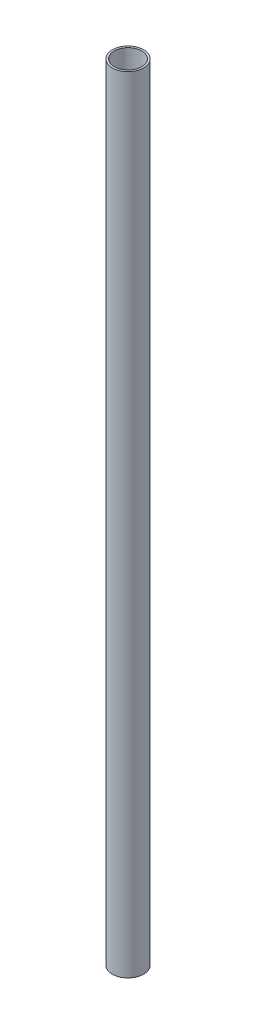
ISO-10303-21;
HEADER;
FILE_DESCRIPTION(('STEP AP214'),'2;1');
FILE_NAME('part.step','',(''),(''),'','','');
FILE_SCHEMA(('AUTOMOTIVE_DESIGN { 1 0 10303 214 1 1 1 1 }'));
ENDSEC;
DATA;
#1=APPLICATION_CONTEXT('core data for automotive mechanical design processes');
#2=APPLICATION_PROTOCOL_DEFINITION('international standard','automotive_design',2000,#1);
#3=PRODUCT_CONTEXT('',#1,'mechanical');
#4=PRODUCT('Part','Part','',(#3));
#5=PRODUCT_RELATED_PRODUCT_CATEGORY('part','',(#4));
#6=PRODUCT_DEFINITION_FORMATION('','',#4);
#7=PRODUCT_DEFINITION_CONTEXT('part definition',#1,'design');
#8=PRODUCT_DEFINITION('design','',#6,#7);
#9=PRODUCT_DEFINITION_SHAPE('','',#8);
#10=(LENGTH_UNIT() NAMED_UNIT(*) SI_UNIT(.MILLI.,.METRE.));
#11=(NAMED_UNIT(*) PLANE_ANGLE_UNIT() SI_UNIT($,.RADIAN.));
#12=(NAMED_UNIT(*) SI_UNIT($,.STERADIAN.) SOLID_ANGLE_UNIT());
#13=UNCERTAINTY_MEASURE_WITH_UNIT(LENGTH_MEASURE(1.E-05),#10,'distance_accuracy_value','');
#14=(GEOMETRIC_REPRESENTATION_CONTEXT(3) GLOBAL_UNCERTAINTY_ASSIGNED_CONTEXT((#13)) GLOBAL_UNIT_ASSIGNED_CONTEXT((#10,
#11,#12)) REPRESENTATION_CONTEXT('',''));
#15=CARTESIAN_POINT('',(0.,0.,0.));
#16=DIRECTION('',(0.,0.,1.));
#17=DIRECTION('',(1.,0.,0.));
#18=AXIS2_PLACEMENT_3D('',#15,#16,#17);
#19=CARTESIAN_POINT('',(0.,5.,0.));
#20=DIRECTION('',(0.,1.,0.));
#21=DIRECTION('',(0.,0.,1.));
#22=AXIS2_PLACEMENT_3D('',#19,#20,#21);
#23=PLANE('',#22);
#24=CARTESIAN_POINT('',(0.,5.,0.));
#25=DIRECTION('',(0.,1.,0.));
#26=DIRECTION('',(0.,0.,1.));
#27=AXIS2_PLACEMENT_3D('',#24,#25,#26);
#28=CIRCLE('',#27,3.5);
#29=CARTESIAN_POINT('',(0.,5.,3.5));
#30=VERTEX_POINT('',#29);
#31=EDGE_CURVE('E48',#30,#30,#28,.T.);
#32=ORIENTED_EDGE('',*,*,#31,.T.);
#33=EDGE_LOOP('',(#32));
#34=FACE_BOUND('',#33,.T.);
#35=CARTESIAN_POINT('',(0.,5.,0.));
#36=DIRECTION('',(0.,-1.,0.));
#37=DIRECTION('',(0.,0.,-1.));
#38=AXIS2_PLACEMENT_3D('',#35,#36,#37);
#39=CIRCLE('',#38,4.);
#40=CARTESIAN_POINT('',(0.,5.,-4.));
#41=VERTEX_POINT('',#40);
#42=EDGE_CURVE('E44',#41,#41,#39,.T.);
#43=ORIENTED_EDGE('',*,*,#42,.T.);
#44=EDGE_LOOP('',(#43));
#45=FACE_BOUND('',#44,.T.);
#46=ADVANCED_FACE('F33',(#34,#45),#23,.F.);
#47=CARTESIAN_POINT('',(0.,205.,0.));
#48=DIRECTION('',(0.,1.,0.));
#49=DIRECTION('',(0.,0.,1.));
#50=AXIS2_PLACEMENT_3D('',#47,#48,#49);
#51=PLANE('',#50);
#52=CARTESIAN_POINT('',(0.,205.,0.));
#53=DIRECTION('',(0.,1.,0.));
#54=DIRECTION('',(0.,0.,1.));
#55=AXIS2_PLACEMENT_3D('',#52,#53,#54);
#56=CIRCLE('',#55,3.5);
#57=CARTESIAN_POINT('',(0.,205.,3.5));
#58=VERTEX_POINT('',#57);
#59=EDGE_CURVE('E53',#58,#58,#56,.T.);
#60=ORIENTED_EDGE('',*,*,#59,.F.);
#61=EDGE_LOOP('',(#60));
#62=FACE_BOUND('',#61,.T.);
#63=CARTESIAN_POINT('',(0.,205.,0.));
#64=DIRECTION('',(0.,-1.,0.));
#65=DIRECTION('',(0.,0.,-1.));
#66=AXIS2_PLACEMENT_3D('',#63,#64,#65);
#67=CIRCLE('',#66,4.);
#68=CARTESIAN_POINT('',(0.,205.,-4.));
#69=VERTEX_POINT('',#68);
#70=EDGE_CURVE('E10',#69,#69,#67,.T.);
#71=ORIENTED_EDGE('',*,*,#70,.F.);
#72=EDGE_LOOP('',(#71));
#73=FACE_BOUND('',#72,.T.);
#74=ADVANCED_FACE('F75',(#62,#73),#51,.T.);
#75=CARTESIAN_POINT('',(0.,5.,0.));
#76=DIRECTION('',(0.,-1.,0.));
#77=DIRECTION('',(0.,0.,-1.));
#78=AXIS2_PLACEMENT_3D('',#75,#76,#77);
#79=CYLINDRICAL_SURFACE('',#78,4.);
#80=CARTESIAN_POINT('',(-3.70809924354783,27.7,-1.5));
#81=CARTESIAN_POINT('',(-3.70809640633806,27.6189925162792,-1.50000304106109));
#82=CARTESIAN_POINT('',(-3.71078260240986,27.5380050774964,-1.49341597549487));
#83=CARTESIAN_POINT('',(-3.72116159304967,27.3784719170868,-1.46736187895468));
#84=CARTESIAN_POINT('',(-3.72885423767112,27.299926122405,-1.44789523373263));
#85=CARTESIAN_POINT('',(-3.748254802809,27.1476246283865,-1.39689657610574));
#86=CARTESIAN_POINT('',(-3.7599530956926,27.0738579433489,-1.36539347266348));
#87=CARTESIAN_POINT('',(-3.78603134206598,26.9326281031812,-1.29131856742698));
#88=CARTESIAN_POINT('',(-3.80041210067323,26.8651668497175,-1.24874344095039));
#89=CARTESIAN_POINT('',(-3.83103574665713,26.7351096883772,-1.15146661374162));
#90=CARTESIAN_POINT('',(-3.84733341923603,26.6728714703706,-1.09630381213306));
#91=CARTESIAN_POINT('',(-3.87949750628547,26.5582771853285,-0.976395839778928));
#92=CARTESIAN_POINT('',(-3.89536382814785,26.5059232262581,-0.911648630256681));
#93=CARTESIAN_POINT('',(-3.92552873936553,26.4108604877044,-0.771694655177602));
#94=CARTESIAN_POINT('',(-3.93975561223505,26.3685405252841,-0.696206947538029));
#95=CARTESIAN_POINT('',(-3.96438007973847,26.2973488274751,-0.538555771965249));
#96=CARTESIAN_POINT('',(-3.97477900217006,26.268472428008,-0.456394630933537));
#97=CARTESIAN_POINT('',(-3.9901869710344,26.2262421042254,-0.291489341676833));
#98=CARTESIAN_POINT('',(-3.99540915214774,26.2122723725595,-0.208923197281597));
#99=CARTESIAN_POINT('',(-4.0006401410794,26.198278799055,-0.0424643637947864));
#100=CARTESIAN_POINT('',(-4.00065064414902,26.1982504223813,0.0414278850628325));
#101=CARTESIAN_POINT('',(-3.99559265903894,26.2117817614652,0.203743543064475));
#102=CARTESIAN_POINT('',(-3.99077541996683,26.2246692979488,0.2822321782669));
#103=CARTESIAN_POINT('',(-3.97693274932263,26.2625359152256,0.435839217984391));
#104=CARTESIAN_POINT('',(-3.96790701975578,26.287515852262,0.510957383430298));
#105=CARTESIAN_POINT('',(-3.94637769167531,26.3491704516758,0.656989017303104));
#106=CARTESIAN_POINT('',(-3.93382539470077,26.3860100052684,0.72782539228731));
#107=CARTESIAN_POINT('',(-3.90651310225279,26.4701920969294,0.86248660795756));
#108=CARTESIAN_POINT('',(-3.8917523951284,26.5175380230176,0.926309176932323));
#109=CARTESIAN_POINT('',(-3.86052529655816,26.6246272862832,1.04909048680094));
#110=CARTESIAN_POINT('',(-3.84400963763883,26.6849339156504,1.10754614526348));
#111=CARTESIAN_POINT('',(-3.81182460645722,26.8145929933216,1.21370395569342));
#112=CARTESIAN_POINT('',(-3.79615544748847,26.8839477065866,1.261403406929));
#113=CARTESIAN_POINT('',(-3.76712703500335,27.0317194674628,1.34565611808152));
#114=CARTESIAN_POINT('',(-3.75382677150277,27.1103034936861,1.38193847851831));
#115=CARTESIAN_POINT('',(-3.73172438629002,27.2730962251676,1.44056464441501));
#116=CARTESIAN_POINT('',(-3.72291976205783,27.3573017715937,1.46291620605595));
#117=CARTESIAN_POINT('',(-3.71139597222848,27.523975962316,1.49190191709668));
#118=CARTESIAN_POINT('',(-3.70836785241537,27.6062841055361,1.49933521158966));
#119=CARTESIAN_POINT('',(-3.70786539525016,27.7710093567417,1.50057885636272));
#120=CARTESIAN_POINT('',(-3.71038967003987,27.8534264323525,1.49439261093762));
#121=CARTESIAN_POINT('',(-3.72039381629735,28.0119299222877,1.46929733520157));
#122=CARTESIAN_POINT('',(-3.72763276216449,28.0881311357647,1.45100618334225));
#123=CARTESIAN_POINT('',(-3.74596487046362,28.2363479447202,1.40299774640638));
#124=CARTESIAN_POINT('',(-3.75705882250173,28.3083626791681,1.37327812034623));
#125=CARTESIAN_POINT('',(-3.7823624311608,28.4491644380762,1.30200292275278));
#126=CARTESIAN_POINT('',(-3.79667328892065,28.5177292921373,1.26004545177047));
#127=CARTESIAN_POINT('',(-3.82662814294291,28.647128981726,1.16591317862479));
#128=CARTESIAN_POINT('',(-3.84227262594077,28.7079609746246,1.11373463696435));
#129=CARTESIAN_POINT('',(-3.87433046553184,28.8241683731951,0.996727340900937));
#130=CARTESIAN_POINT('',(-3.89072969357028,28.8789534087688,0.931306341491061));
#131=CARTESIAN_POINT('',(-3.92149874963302,28.9768383675894,0.791797471753151));
#132=CARTESIAN_POINT('',(-3.93586857107664,29.0199382529458,0.717709573322674));
#133=CARTESIAN_POINT('',(-3.96094985704552,29.0929460561996,0.563016329468479));
#134=CARTESIAN_POINT('',(-3.9716738133801,29.1228991237926,0.482434433064628));
#135=CARTESIAN_POINT('',(-3.98829436712571,29.1686564138499,0.316881887523256));
#136=CARTESIAN_POINT('',(-3.99419323299413,29.1844672854224,0.231913320723594));
#137=CARTESIAN_POINT('',(-4.00028407317073,29.2007744027548,0.065335585273816));
#138=CARTESIAN_POINT('',(-4.00078860953764,29.202109483059,-0.0161807680608448));
#139=CARTESIAN_POINT('',(-3.99684889809223,29.1915848405546,-0.178226786412423));
#140=CARTESIAN_POINT('',(-3.9924052471313,29.1797267091141,-0.258756569245257));
#141=CARTESIAN_POINT('',(-3.97921089603771,29.1437411485064,-0.414548248377125));
#142=CARTESIAN_POINT('',(-3.97056791378017,29.1199200941216,-0.489890731068834));
#143=CARTESIAN_POINT('',(-3.9498778362099,29.0609899866156,-0.635515473006389));
#144=CARTESIAN_POINT('',(-3.93783009655664,29.0258787966952,-0.705796771275541));
#145=CARTESIAN_POINT('',(-3.91090618300074,28.9436860564952,-0.842540176994412));
#146=CARTESIAN_POINT('',(-3.89593240108829,28.8961633594859,-0.908717548846849));
#147=CARTESIAN_POINT('',(-3.86499507694844,28.7911921698124,-1.03241734752336));
#148=CARTESIAN_POINT('',(-3.84903118274027,28.7337401341921,-1.0899366712559));
#149=CARTESIAN_POINT('',(-3.81688129739175,28.6069358683549,-1.19781214236196));
#150=CARTESIAN_POINT('',(-3.8007280534916,28.5371155978457,-1.24762999816025));
#151=CARTESIAN_POINT('',(-3.77098325003638,28.3895841304267,-1.33484709556843));
#152=CARTESIAN_POINT('',(-3.75739195631216,28.3118721159465,-1.37224504878157));
#153=CARTESIAN_POINT('',(-3.73402269853266,28.1470443190246,-1.4346588697426));
#154=CARTESIAN_POINT('',(-3.7244380329086,28.0596656334882,-1.45906002899523));
#155=CARTESIAN_POINT('',(-3.71147994336315,27.8815147280442,-1.49172356722079));
#156=CARTESIAN_POINT('',(-3.70810242179736,27.79074478729,-1.49999659339571));
#157=CARTESIAN_POINT('',(-3.70809924354783,27.7,-1.5));
#158=B_SPLINE_CURVE_WITH_KNOTS('',3,(#80,#81,#82,#83,#84,#85,#86,#87,#88,#89,#90,#91,#92,#93,
#94,#95,#96,#97,#98,#99,#100,#101,#102,#103,#104,#105,#106,#107,#108,#109,#110,#111,#112,#113,
#114,#115,#116,#117,#118,#119,#120,#121,#122,#123,#124,#125,#126,#127,#128,#129,#130,#131,#132,
#133,#134,#135,#136,#137,#138,#139,#140,#141,#142,#143,#144,#145,#146,#147,#148,#149,#150,#151,
#152,#153,#154,#155,#156,#157),.UNSPECIFIED.,.T.,.F.,(4,2,2,2,2,2,2,2,2,2,2,2,2,2,2,2,2,2,2,2,2,
2,2,2,2,2,2,2,2,2,2,2,2,2,2,2,2,2,4),(0.,0.242684541416171,0.485361814598854,0.727459856757032,
0.969630679682935,1.22274652401128,1.47591628822983,1.73770072136421,1.9993942638133,
2.24980018489679,2.50012465404857,2.73806472803194,2.97602165263335,3.21744131210668,
3.45893893628976,3.71456675065874,3.97025867827335,4.23162592252966,4.49284751635474,
4.73965657740485,4.98640395388884,5.22143845928198,5.45652113429526,5.70041561005822,
5.94439948466355,6.20385016993624,6.46330169650178,6.72185508890168,6.98028685560127,
7.22365720549936,7.4669982031948,7.7044027400389,7.94185223512831,8.18928323676987,
8.43680270894965,8.69738599542079,8.95799630544242,9.23003178870926,9.50188762323053),.UNSPECIFIED.);
#159=CARTESIAN_POINT('',(-3.70809924354783,27.7,-1.5));
#160=VERTEX_POINT('',#159);
#161=EDGE_CURVE('E56',#160,#160,#158,.T.);
#162=ORIENTED_EDGE('',*,*,#161,.F.);
#163=EDGE_LOOP('',(#162));
#164=FACE_BOUND('',#163,.T.);
#165=ORIENTED_EDGE('',*,*,#70,.T.);
#166=EDGE_LOOP('',(#165));
#167=FACE_BOUND('',#166,.T.);
#168=ORIENTED_EDGE('',*,*,#42,.F.);
#169=EDGE_LOOP('',(#168));
#170=FACE_BOUND('',#169,.T.);
#171=ADVANCED_FACE('F61',(#164,#167,#170),#79,.T.);
#172=CARTESIAN_POINT('',(0.,-17.5790615212308,0.));
#173=DIRECTION('',(0.,1.,0.));
#174=DIRECTION('',(0.,0.,1.));
#175=AXIS2_PLACEMENT_3D('',#172,#173,#174);
#176=CYLINDRICAL_SURFACE('',#175,3.5);
#177=CARTESIAN_POINT('',(-3.16227766016838,27.7,-1.5));
#178=CARTESIAN_POINT('',(-3.16228717298615,27.6202310669546,-1.49999038492545));
#179=CARTESIAN_POINT('',(-3.16534018013074,27.5403418583581,-1.49359660659694));
#180=CARTESIAN_POINT('',(-3.17716042981265,27.3828833369264,-1.46827542593982));
#181=CARTESIAN_POINT('',(-3.18594276667924,27.3053207198614,-1.44931491353816));
#182=CARTESIAN_POINT('',(-3.20802619745321,27.1550840582022,-1.39974825661799));
#183=CARTESIAN_POINT('',(-3.22130811955254,27.0823908146556,-1.3691914561727));
#184=CARTESIAN_POINT('',(-3.25086693275557,26.9431820705643,-1.29744502147729));
#185=CARTESIAN_POINT('',(-3.26714323581242,26.8766653609032,-1.25625747429105));
#186=CARTESIAN_POINT('',(-3.3020556513051,26.7472750843835,-1.16151711863134));
#187=CARTESIAN_POINT('',(-3.32077467653238,26.6848572691847,-1.10737213961854));
#188=CARTESIAN_POINT('',(-3.35778390832689,26.5696486675996,-0.989495816865002));
#189=CARTESIAN_POINT('',(-3.37607394135677,26.5168617205288,-0.925760668427731));
#190=CARTESIAN_POINT('',(-3.41118222051011,26.4200404953643,-0.786887444118551));
#191=CARTESIAN_POINT('',(-3.42789293367331,26.3765254048694,-0.711357726755064));
#192=CARTESIAN_POINT('',(-3.4569371087723,26.3030178857841,-0.553203581147161));
#193=CARTESIAN_POINT('',(-3.46927262014747,26.2730191240674,-0.470582497238453));
#194=CARTESIAN_POINT('',(-3.48758735586712,26.2290674894389,-0.305382130945825));
#195=CARTESIAN_POINT('',(-3.49387724164572,26.2143269675171,-0.223047558846185));
#196=CARTESIAN_POINT('',(-3.50052462942354,26.1987586496056,-0.056849700005753));
#197=CARTESIAN_POINT('',(-3.50088468598068,26.1979248626218,0.0270129128697519));
#198=CARTESIAN_POINT('',(-3.49581016618033,26.2097951243902,0.188134207596877));
#199=CARTESIAN_POINT('',(-3.49074679776828,26.2216318999745,0.265470719086095));
#200=CARTESIAN_POINT('',(-3.47591102813446,26.2570120343274,0.416935858912369));
#201=CARTESIAN_POINT('',(-3.46613827891648,26.2805562582134,0.491064249746501));
#202=CARTESIAN_POINT('',(-3.44263346664963,26.3389532948628,0.635378985342394));
#203=CARTESIAN_POINT('',(-3.42884310391306,26.3739736461748,0.705487647304971));
#204=CARTESIAN_POINT('',(-3.39863837501696,26.4541586776779,0.839017665141778));
#205=CARTESIAN_POINT('',(-3.38222306678434,26.4993270022658,0.902436606512516));
#206=CARTESIAN_POINT('',(-3.34696895152063,26.6024047533429,1.02577392003805));
#207=CARTESIAN_POINT('',(-3.32804069559209,26.6610094348956,1.08508648843663));
#208=CARTESIAN_POINT('',(-3.29078815665823,26.7873514158162,1.19331308888253));
#209=CARTESIAN_POINT('',(-3.27246413723674,26.8550926368739,1.24222263226406));
#210=CARTESIAN_POINT('',(-3.23783417736942,27.0008899372612,1.32993971380651));
#211=CARTESIAN_POINT('',(-3.22162619167355,27.079232072845,1.36831384702014));
#212=CARTESIAN_POINT('',(-3.19424697319981,27.2421445042791,1.43107385954865));
#213=CARTESIAN_POINT('',(-3.18307189830842,27.3267099916605,1.45547041320372));
#214=CARTESIAN_POINT('',(-3.16799275229804,27.4935863977836,1.48799335058118));
#215=CARTESIAN_POINT('',(-3.16364898851198,27.5756644902977,1.49710640039855));
#216=CARTESIAN_POINT('',(-3.16146494308516,27.7402744875601,1.50171565988816));
#217=CARTESIAN_POINT('',(-3.16362218505066,27.8228062075553,1.49721705457354));
#218=CARTESIAN_POINT('',(-3.17374071577831,27.9799312868702,1.47563239208818));
#219=CARTESIAN_POINT('',(-3.18128847435202,28.0546778701854,1.45944230541441));
#220=CARTESIAN_POINT('',(-3.2007978650071,28.2003227381853,1.41614006363835));
#221=CARTESIAN_POINT('',(-3.21276056926751,28.2712200832728,1.38902525529709));
#222=CARTESIAN_POINT('',(-3.24038333624188,28.410604945145,1.32334189052693));
#223=CARTESIAN_POINT('',(-3.25618154123646,28.4788536609093,1.28432659707742));
#224=CARTESIAN_POINT('',(-3.28950916992049,28.6081753527573,1.19638562157086));
#225=CARTESIAN_POINT('',(-3.3070393706057,28.6692450811052,1.14745548114547));
#226=CARTESIAN_POINT('',(-3.34369698282831,28.7880144627796,1.03605747720158));
#227=CARTESIAN_POINT('',(-3.36283055507213,28.8449576185857,0.972781802419171));
#228=CARTESIAN_POINT('',(-3.39913473749074,28.9475671186635,0.837142334524678));
#229=CARTESIAN_POINT('',(-3.41630515097051,28.9932323334938,0.764777632276175));
#230=CARTESIAN_POINT('',(-3.44690719585056,29.0720413448052,0.612290393672595));
#231=CARTESIAN_POINT('',(-3.46032004460384,29.1051225227759,0.53213149058258));
#232=CARTESIAN_POINT('',(-3.48173830246699,29.1570748994456,0.36665988151858));
#233=CARTESIAN_POINT('',(-3.48974713693762,29.1759551003755,0.281350477650408));
#234=CARTESIAN_POINT('',(-3.49904040627988,29.1977887288074,0.11474019183488));
#235=CARTESIAN_POINT('',(-3.50077418524232,29.2018069056777,0.0336030421543021));
#236=CARTESIAN_POINT('',(-3.49858700907225,29.1967022452109,-0.128169808807152));
#237=CARTESIAN_POINT('',(-3.49466715001972,29.1875819550501,-0.208805604242759));
#238=CARTESIAN_POINT('',(-3.48185611932799,29.157223231529,-0.36402240513826));
#239=CARTESIAN_POINT('',(-3.47316550610207,29.1364730162902,-0.43871686706603));
#240=CARTESIAN_POINT('',(-3.45179100848821,29.0839919680782,-0.583524431853925));
#241=CARTESIAN_POINT('',(-3.43910638916064,29.052259114076,-0.653636688669973));
#242=CARTESIAN_POINT('',(-3.41024047270082,28.977104822088,-0.790820855389583));
#243=CARTESIAN_POINT('',(-3.39392604407178,28.9332161473868,-0.857608099366122));
#244=CARTESIAN_POINT('',(-3.35970811620735,28.8356600352708,-0.983159576175433));
#245=CARTESIAN_POINT('',(-3.341803989688,28.7819887288222,-1.04192061850001));
#246=CARTESIAN_POINT('',(-3.30477972078024,28.6618044913906,-1.15419921481671));
#247=CARTESIAN_POINT('',(-3.28566570654981,28.5946419918799,-1.20702595263291));
#248=CARTESIAN_POINT('',(-3.24969238680823,28.4518407424578,-1.30078077887623));
#249=CARTESIAN_POINT('',(-3.23283439654742,28.3761970948967,-1.34170194259386));
#250=CARTESIAN_POINT('',(-3.20355631016088,28.2184264300847,-1.41018371094568));
#251=CARTESIAN_POINT('',(-3.19112824877803,28.1363113768649,-1.43776832759537));
#252=CARTESIAN_POINT('',(-3.17252771438391,27.9680448200845,-1.47837340972956));
#253=CARTESIAN_POINT('',(-3.16633426473114,27.8819078790467,-1.49144272805065));
#254=CARTESIAN_POINT('',(-3.16275406284903,27.7636011550783,-1.49899243118201));
#255=CARTESIAN_POINT('',(-3.16227386666053,27.7318101409096,-1.50000383428566));
#256=CARTESIAN_POINT('',(-3.16227766016838,27.7,-1.5));
#257=B_SPLINE_CURVE_WITH_KNOTS('',3,(#177,#178,#179,#180,#181,#182,#183,#184,#185,#186,#187,
#188,#189,#190,#191,#192,#193,#194,#195,#196,#197,#198,#199,#200,#201,#202,#203,#204,#205,#206,
#207,#208,#209,#210,#211,#212,#213,#214,#215,#216,#217,#218,#219,#220,#221,#222,#223,#224,#225,
#226,#227,#228,#229,#230,#231,#232,#233,#234,#235,#236,#237,#238,#239,#240,#241,#242,#243,#244,
#245,#246,#247,#248,#249,#250,#251,#252,#253,#254,#255,#256),.UNSPECIFIED.,.T.,.F.,(4,2,2,2,2,2,
2,2,2,2,2,2,2,2,2,2,2,2,2,2,2,2,2,2,2,2,2,2,2,2,2,2,2,2,2,2,2,2,2,4),(0.,0.239211516998637,
0.479055812925297,0.717890772651922,0.956678879115818,1.20974703533054,1.46291585698786,
1.72782087173741,1.992601634844,2.24290515697657,2.49310084605823,2.72720452587285,
2.96132550725882,3.19902917219044,3.43681833943188,3.69219429883402,3.94768022455396,
4.21248245374587,4.4770821893896,4.72382987542101,4.97048358104408,5.20000580849601,
5.42958381263239,5.66914358774548,5.9088113247203,6.16934837221378,6.42991150089539,
6.69175474679387,6.95343186577332,7.19595274449671,7.43842661162275,7.67141114258535,
7.90443857025996,8.14809791325949,8.39185383353303,8.65331392763673,8.91492579368383,
9.17606486564864,9.43632235654433,9.53171478279883),.UNSPECIFIED.);
#258=CARTESIAN_POINT('',(-3.16227766016838,27.7,-1.5));
#259=VERTEX_POINT('',#258);
#260=EDGE_CURVE('E36',#259,#259,#257,.T.);
#261=ORIENTED_EDGE('',*,*,#260,.T.);
#262=EDGE_LOOP('',(#261));
#263=FACE_BOUND('',#262,.T.);
#264=ORIENTED_EDGE('',*,*,#59,.T.);
#265=EDGE_LOOP('',(#264));
#266=FACE_BOUND('',#265,.T.);
#267=ORIENTED_EDGE('',*,*,#31,.F.);
#268=EDGE_LOOP('',(#267));
#269=FACE_BOUND('',#268,.T.);
#270=ADVANCED_FACE('F66',(#263,#266,#269),#176,.F.);
#271=CARTESIAN_POINT('',(-22.,27.7,0.));
#272=DIRECTION('',(1.,0.,0.));
#273=DIRECTION('',(0.,0.,-1.));
#274=AXIS2_PLACEMENT_3D('',#271,#272,#273);
#275=CYLINDRICAL_SURFACE('',#274,1.5);
#276=ORIENTED_EDGE('',*,*,#161,.T.);
#277=EDGE_LOOP('',(#276));
#278=FACE_BOUND('',#277,.T.);
#279=ORIENTED_EDGE('',*,*,#260,.F.);
#280=EDGE_LOOP('',(#279));
#281=FACE_BOUND('',#280,.T.);
#282=ADVANCED_FACE('F63',(#278,#281),#275,.F.);
#283=CLOSED_SHELL('',(#46,#74,#171,#270,#282));
#284=MANIFOLD_SOLID_BREP('B2',#283);
#285=ADVANCED_BREP_SHAPE_REPRESENTATION('',(#18,#284),#14);
#286=SHAPE_DEFINITION_REPRESENTATION(#9,#285);
ENDSEC;
END-ISO-10303-21;
